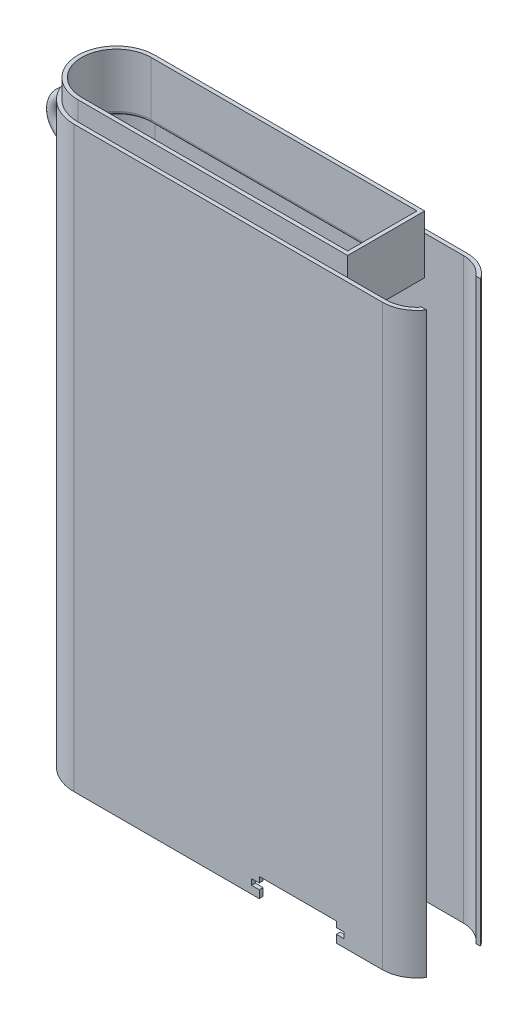
ISO-10303-21;
HEADER;
FILE_DESCRIPTION(('STEP AP214'),'2;1');
FILE_NAME('part.step','',(''),(''),'','','');
FILE_SCHEMA(('AUTOMOTIVE_DESIGN { 1 0 10303 214 1 1 1 1 }'));
ENDSEC;
DATA;
#1=APPLICATION_CONTEXT('core data for automotive mechanical design processes');
#2=APPLICATION_PROTOCOL_DEFINITION('international standard','automotive_design',2000,#1);
#3=PRODUCT_CONTEXT('',#1,'mechanical');
#4=PRODUCT('Part','Part','',(#3));
#5=PRODUCT_RELATED_PRODUCT_CATEGORY('part','',(#4));
#6=PRODUCT_DEFINITION_FORMATION('','',#4);
#7=PRODUCT_DEFINITION_CONTEXT('part definition',#1,'design');
#8=PRODUCT_DEFINITION('design','',#6,#7);
#9=PRODUCT_DEFINITION_SHAPE('','',#8);
#10=(LENGTH_UNIT() NAMED_UNIT(*) SI_UNIT(.MILLI.,.METRE.));
#11=(NAMED_UNIT(*) PLANE_ANGLE_UNIT() SI_UNIT($,.RADIAN.));
#12=(NAMED_UNIT(*) SI_UNIT($,.STERADIAN.) SOLID_ANGLE_UNIT());
#13=UNCERTAINTY_MEASURE_WITH_UNIT(LENGTH_MEASURE(1.E-05),#10,'distance_accuracy_value','');
#14=(GEOMETRIC_REPRESENTATION_CONTEXT(3) GLOBAL_UNCERTAINTY_ASSIGNED_CONTEXT((#13)) GLOBAL_UNIT_ASSIGNED_CONTEXT((#10,
#11,#12)) REPRESENTATION_CONTEXT('',''));
#15=CARTESIAN_POINT('',(0.,0.,0.));
#16=DIRECTION('',(0.,0.,1.));
#17=DIRECTION('',(1.,0.,0.));
#18=AXIS2_PLACEMENT_3D('',#15,#16,#17);
#19=CARTESIAN_POINT('',(-11.,145.,0.));
#20=DIRECTION('',(-1.,0.,0.));
#21=DIRECTION('',(0.,-1.,0.));
#22=AXIS2_PLACEMENT_3D('',#19,#20,#21);
#23=PLANE('',#22);
#24=CARTESIAN_POINT('',(-11.,145.,0.));
#25=DIRECTION('',(-1.,0.,0.));
#26=DIRECTION('',(0.,-1.,0.));
#27=AXIS2_PLACEMENT_3D('',#24,#25,#26);
#28=CIRCLE('',#27,1.5);
#29=CARTESIAN_POINT('',(-11.,146.5,0.));
#30=VERTEX_POINT('',#29);
#31=EDGE_CURVE('E61',#30,#30,#28,.T.);
#32=ORIENTED_EDGE('',*,*,#31,.F.);
#33=EDGE_LOOP('',(#32));
#34=FACE_BOUND('',#33,.T.);
#35=ADVANCED_FACE('F55',(#34),#23,.F.);
#36=CARTESIAN_POINT('',(-11.,135.,0.));
#37=DIRECTION('',(1.,0.,0.));
#38=DIRECTION('',(0.,1.,0.));
#39=AXIS2_PLACEMENT_3D('',#36,#37,#38);
#40=PLANE('',#39);
#41=CARTESIAN_POINT('',(-11.,135.,0.));
#42=DIRECTION('',(1.,0.,0.));
#43=DIRECTION('',(0.,1.,0.));
#44=AXIS2_PLACEMENT_3D('',#41,#42,#43);
#45=CIRCLE('',#44,1.5);
#46=CARTESIAN_POINT('',(-11.,133.5,0.));
#47=VERTEX_POINT('',#46);
#48=EDGE_CURVE('E12',#47,#47,#45,.T.);
#49=ORIENTED_EDGE('',*,*,#48,.T.);
#50=EDGE_LOOP('',(#49));
#51=FACE_BOUND('',#50,.T.);
#52=ADVANCED_FACE('F70',(#51),#40,.T.);
#53=CARTESIAN_POINT('',(-11.,140.,0.));
#54=DIRECTION('',(0.,0.,1.));
#55=DIRECTION('',(1.,0.,0.));
#56=AXIS2_PLACEMENT_3D('',#53,#54,#55);
#57=TOROIDAL_SURFACE('',#56,5.,1.5);
#58=CARTESIAN_POINT('',(-11.,140.,0.));
#59=DIRECTION('',(0.,0.,1.));
#60=DIRECTION('',(1.,0.,0.));
#61=AXIS2_PLACEMENT_3D('',#58,#59,#60);
#62=CIRCLE('',#61,6.5);
#63=EDGE_CURVE('',#30,#47,#62,.T.);
#64=ORIENTED_EDGE('',*,*,#31,.T.);
#65=ORIENTED_EDGE('',*,*,#48,.F.);
#66=ORIENTED_EDGE('',*,*,#63,.T.);
#67=ORIENTED_EDGE('',*,*,#63,.F.);
#68=EDGE_LOOP('',(#64,#66,#65,#67));
#69=FACE_BOUND('',#68,.T.);
#70=ADVANCED_FACE('F67',(#69),#57,.T.);
#71=CLOSED_SHELL('',(#35,#52,#70));
#72=MANIFOLD_SOLID_BREP('B2',#71);
#73=CARTESIAN_POINT('',(0.,155.,0.));
#74=DIRECTION('',(0.,1.,0.));
#75=DIRECTION('',(0.,0.,1.));
#76=AXIS2_PLACEMENT_3D('',#73,#74,#75);
#77=PLANE('',#76);
#78=CARTESIAN_POINT('',(0.,155.,0.));
#79=DIRECTION('',(0.,1.,0.));
#80=DIRECTION('',(0.,0.,1.));
#81=AXIS2_PLACEMENT_3D('',#78,#79,#80);
#82=CIRCLE('',#81,10.);
#83=CARTESIAN_POINT('',(0.,155.,-10.));
#84=VERTEX_POINT('',#83);
#85=CARTESIAN_POINT('',(0.,155.,10.));
#86=VERTEX_POINT('',#85);
#87=EDGE_CURVE('E209',#84,#86,#82,.T.);
#88=ORIENTED_EDGE('',*,*,#87,.T.);
#89=DIRECTION('',(1.,0.,0.));
#90=VECTOR('',#89,1.);
#91=CARTESIAN_POINT('',(0.,155.,10.));
#92=LINE('',#91,#90);
#93=CARTESIAN_POINT('',(70.,155.,10.));
#94=VERTEX_POINT('',#93);
#95=EDGE_CURVE('E212',#86,#94,#92,.T.);
#96=ORIENTED_EDGE('',*,*,#95,.T.);
#97=DIRECTION('',(0.,0.,-1.));
#98=VECTOR('',#97,1.);
#99=CARTESIAN_POINT('',(70.,155.,-10.));
#100=LINE('',#99,#98);
#101=CARTESIAN_POINT('',(70.,155.,-10.));
#102=VERTEX_POINT('',#101);
#103=EDGE_CURVE('E215',#94,#102,#100,.T.);
#104=ORIENTED_EDGE('',*,*,#103,.T.);
#105=DIRECTION('',(-1.,0.,0.));
#106=VECTOR('',#105,1.);
#107=CARTESIAN_POINT('',(0.,155.,-10.));
#108=LINE('',#107,#106);
#109=EDGE_CURVE('E217',#102,#84,#108,.T.);
#110=ORIENTED_EDGE('',*,*,#109,.T.);
#111=EDGE_LOOP('',(#88,#96,#104,#110));
#112=FACE_BOUND('',#111,.T.);
#113=DIRECTION('',(-1.,0.,0.));
#114=VECTOR('',#113,1.);
#115=CARTESIAN_POINT('',(0.,155.,-9.));
#116=LINE('',#115,#114);
#117=CARTESIAN_POINT('',(69.,155.,-9.));
#118=VERTEX_POINT('',#117);
#119=CARTESIAN_POINT('',(0.,155.,-9.));
#120=VERTEX_POINT('',#119);
#121=EDGE_CURVE('E189',#118,#120,#116,.T.);
#122=ORIENTED_EDGE('',*,*,#121,.F.);
#123=DIRECTION('',(0.,0.,-1.));
#124=VECTOR('',#123,1.);
#125=CARTESIAN_POINT('',(69.,155.,9.));
#126=LINE('',#125,#124);
#127=CARTESIAN_POINT('',(69.,155.,9.));
#128=VERTEX_POINT('',#127);
#129=EDGE_CURVE('E180',#128,#118,#126,.T.);
#130=ORIENTED_EDGE('',*,*,#129,.F.);
#131=DIRECTION('',(1.,0.,0.));
#132=VECTOR('',#131,1.);
#133=CARTESIAN_POINT('',(0.,155.,9.));
#134=LINE('',#133,#132);
#135=CARTESIAN_POINT('',(0.,155.,9.));
#136=VERTEX_POINT('',#135);
#137=EDGE_CURVE('E200',#136,#128,#134,.T.);
#138=ORIENTED_EDGE('',*,*,#137,.F.);
#139=CARTESIAN_POINT('',(0.,155.,0.));
#140=DIRECTION('',(0.,1.,0.));
#141=DIRECTION('',(0.,0.,1.));
#142=AXIS2_PLACEMENT_3D('',#139,#140,#141);
#143=CIRCLE('',#142,9.);
#144=EDGE_CURVE('E198',#120,#136,#143,.T.);
#145=ORIENTED_EDGE('',*,*,#144,.F.);
#146=EDGE_LOOP('',(#122,#130,#138,#145));
#147=FACE_BOUND('',#146,.T.);
#148=ADVANCED_FACE('F104',(#112,#147),#77,.T.);
#149=CARTESIAN_POINT('',(0.,140.,0.));
#150=DIRECTION('',(0.,1.,0.));
#151=DIRECTION('',(0.,0.,1.));
#152=AXIS2_PLACEMENT_3D('',#149,#150,#151);
#153=PLANE('',#152);
#154=DIRECTION('',(1.,0.,0.));
#155=VECTOR('',#154,1.);
#156=CARTESIAN_POINT('',(0.,140.,10.));
#157=LINE('',#156,#155);
#158=CARTESIAN_POINT('',(69.,140.,10.));
#159=VERTEX_POINT('',#158);
#160=CARTESIAN_POINT('',(70.,140.,10.));
#161=VERTEX_POINT('',#160);
#162=EDGE_CURVE('E222',#159,#161,#157,.T.);
#163=ORIENTED_EDGE('',*,*,#162,.F.);
#164=DIRECTION('',(0.,0.,-1.));
#165=VECTOR('',#164,1.);
#166=CARTESIAN_POINT('',(69.,140.,9.));
#167=LINE('',#166,#165);
#168=CARTESIAN_POINT('',(69.,140.,-10.));
#169=VERTEX_POINT('',#168);
#170=EDGE_CURVE('E190',#159,#169,#167,.T.);
#171=ORIENTED_EDGE('',*,*,#170,.T.);
#172=DIRECTION('',(-1.,0.,0.));
#173=VECTOR('',#172,1.);
#174=CARTESIAN_POINT('',(0.,140.,-10.));
#175=LINE('',#174,#173);
#176=CARTESIAN_POINT('',(70.,140.,-10.));
#177=VERTEX_POINT('',#176);
#178=EDGE_CURVE('E213',#177,#169,#175,.T.);
#179=ORIENTED_EDGE('',*,*,#178,.F.);
#180=DIRECTION('',(0.,0.,-1.));
#181=VECTOR('',#180,1.);
#182=CARTESIAN_POINT('',(70.,140.,-10.));
#183=LINE('',#182,#181);
#184=EDGE_CURVE('E226',#161,#177,#183,.T.);
#185=ORIENTED_EDGE('',*,*,#184,.F.);
#186=EDGE_LOOP('',(#163,#171,#179,#185));
#187=FACE_BOUND('',#186,.T.);
#188=ADVANCED_FACE('F268',(#187),#153,.F.);
#189=CARTESIAN_POINT('',(0.,155.,0.));
#190=DIRECTION('',(0.,-1.,0.));
#191=DIRECTION('',(0.,0.,-1.));
#192=AXIS2_PLACEMENT_3D('',#189,#190,#191);
#193=CYLINDRICAL_SURFACE('',#192,10.);
#194=CARTESIAN_POINT('',(0.,140.,0.));
#195=DIRECTION('',(0.,1.,0.));
#196=DIRECTION('',(0.,0.,1.));
#197=AXIS2_PLACEMENT_3D('',#194,#195,#196);
#198=CIRCLE('',#197,10.);
#199=CARTESIAN_POINT('',(0.,140.,-10.));
#200=VERTEX_POINT('',#199);
#201=CARTESIAN_POINT('',(0.,140.,10.));
#202=VERTEX_POINT('',#201);
#203=EDGE_CURVE('E193',#200,#202,#198,.T.);
#204=ORIENTED_EDGE('',*,*,#203,.T.);
#205=DIRECTION('',(0.,-1.,0.));
#206=VECTOR('',#205,1.);
#207=CARTESIAN_POINT('',(0.,155.,10.));
#208=LINE('',#207,#206);
#209=EDGE_CURVE('E239',#86,#202,#208,.T.);
#210=ORIENTED_EDGE('',*,*,#209,.F.);
#211=ORIENTED_EDGE('',*,*,#87,.F.);
#212=DIRECTION('',(0.,-1.,0.));
#213=VECTOR('',#212,1.);
#214=CARTESIAN_POINT('',(0.,155.,-10.));
#215=LINE('',#214,#213);
#216=EDGE_CURVE('E219',#84,#200,#215,.T.);
#217=ORIENTED_EDGE('',*,*,#216,.T.);
#218=EDGE_LOOP('',(#204,#210,#211,#217));
#219=FACE_BOUND('',#218,.T.);
#220=ADVANCED_FACE('F291',(#219),#193,.T.);
#221=CARTESIAN_POINT('',(0.,155.,10.));
#222=DIRECTION('',(0.,0.,-1.));
#223=DIRECTION('',(-1.,0.,0.));
#224=AXIS2_PLACEMENT_3D('',#221,#222,#223);
#225=PLANE('',#224);
#226=EDGE_CURVE('E223',#202,#159,#157,.T.);
#227=ORIENTED_EDGE('',*,*,#226,.T.);
#228=ORIENTED_EDGE('',*,*,#162,.T.);
#229=DIRECTION('',(0.,-1.,0.));
#230=VECTOR('',#229,1.);
#231=CARTESIAN_POINT('',(70.,155.,10.));
#232=LINE('',#231,#230);
#233=EDGE_CURVE('E236',#94,#161,#232,.T.);
#234=ORIENTED_EDGE('',*,*,#233,.F.);
#235=ORIENTED_EDGE('',*,*,#95,.F.);
#236=ORIENTED_EDGE('',*,*,#209,.T.);
#237=EDGE_LOOP('',(#227,#228,#234,#235,#236));
#238=FACE_BOUND('',#237,.T.);
#239=ADVANCED_FACE('F271',(#238),#225,.F.);
#240=CARTESIAN_POINT('',(70.,155.,-10.));
#241=DIRECTION('',(-1.,0.,0.));
#242=DIRECTION('',(0.,0.,1.));
#243=AXIS2_PLACEMENT_3D('',#240,#241,#242);
#244=PLANE('',#243);
#245=ORIENTED_EDGE('',*,*,#184,.T.);
#246=DIRECTION('',(0.,-1.,0.));
#247=VECTOR('',#246,1.);
#248=CARTESIAN_POINT('',(70.,155.,-10.));
#249=LINE('',#248,#247);
#250=EDGE_CURVE('E233',#102,#177,#249,.T.);
#251=ORIENTED_EDGE('',*,*,#250,.F.);
#252=ORIENTED_EDGE('',*,*,#103,.F.);
#253=ORIENTED_EDGE('',*,*,#233,.T.);
#254=EDGE_LOOP('',(#245,#251,#252,#253));
#255=FACE_BOUND('',#254,.T.);
#256=ADVANCED_FACE('F297',(#255),#244,.F.);
#257=CARTESIAN_POINT('',(0.,155.,-10.));
#258=DIRECTION('',(0.,0.,1.));
#259=DIRECTION('',(1.,0.,0.));
#260=AXIS2_PLACEMENT_3D('',#257,#258,#259);
#261=PLANE('',#260);
#262=ORIENTED_EDGE('',*,*,#178,.T.);
#263=EDGE_CURVE('E228',#169,#200,#175,.T.);
#264=ORIENTED_EDGE('',*,*,#263,.T.);
#265=ORIENTED_EDGE('',*,*,#216,.F.);
#266=ORIENTED_EDGE('',*,*,#109,.F.);
#267=ORIENTED_EDGE('',*,*,#250,.T.);
#268=EDGE_LOOP('',(#262,#264,#265,#266,#267));
#269=FACE_BOUND('',#268,.T.);
#270=ADVANCED_FACE('F261',(#269),#261,.F.);
#271=CARTESIAN_POINT('',(69.,155.,9.));
#272=DIRECTION('',(-1.,0.,0.));
#273=DIRECTION('',(0.,0.,1.));
#274=AXIS2_PLACEMENT_3D('',#271,#272,#273);
#275=PLANE('',#274);
#276=ORIENTED_EDGE('',*,*,#170,.F.);
#277=CARTESIAN_POINT('',(69.,141.,10.));
#278=DIRECTION('',(-1.,0.,0.));
#279=DIRECTION('',(0.,0.,1.));
#280=AXIS2_PLACEMENT_3D('',#277,#278,#279);
#281=CIRCLE('',#280,1.);
#282=CARTESIAN_POINT('',(69.,141.,9.));
#283=VERTEX_POINT('',#282);
#284=EDGE_CURVE('E113',#159,#283,#281,.F.);
#285=ORIENTED_EDGE('',*,*,#284,.T.);
#286=DIRECTION('',(0.,-1.,0.));
#287=VECTOR('',#286,1.);
#288=CARTESIAN_POINT('',(69.,155.,9.));
#289=LINE('',#288,#287);
#290=EDGE_CURVE('E185',#128,#283,#289,.T.);
#291=ORIENTED_EDGE('',*,*,#290,.F.);
#292=ORIENTED_EDGE('',*,*,#129,.T.);
#293=DIRECTION('',(0.,-1.,0.));
#294=VECTOR('',#293,1.);
#295=CARTESIAN_POINT('',(69.,155.,-9.));
#296=LINE('',#295,#294);
#297=CARTESIAN_POINT('',(69.,141.,-9.));
#298=VERTEX_POINT('',#297);
#299=EDGE_CURVE('E182',#118,#298,#296,.T.);
#300=ORIENTED_EDGE('',*,*,#299,.T.);
#301=CARTESIAN_POINT('',(69.,141.,-10.));
#302=DIRECTION('',(-1.,0.,0.));
#303=DIRECTION('',(0.,0.,1.));
#304=AXIS2_PLACEMENT_3D('',#301,#302,#303);
#305=CIRCLE('',#304,1.);
#306=EDGE_CURVE('E53',#298,#169,#305,.F.);
#307=ORIENTED_EDGE('',*,*,#306,.T.);
#308=EDGE_LOOP('',(#276,#285,#291,#292,#300,#307));
#309=FACE_BOUND('',#308,.T.);
#310=ADVANCED_FACE('F181',(#309),#275,.T.);
#311=CARTESIAN_POINT('',(0.,155.,-9.));
#312=DIRECTION('',(0.,0.,1.));
#313=DIRECTION('',(1.,0.,0.));
#314=AXIS2_PLACEMENT_3D('',#311,#312,#313);
#315=PLANE('',#314);
#316=DIRECTION('',(0.,-1.,0.));
#317=VECTOR('',#316,1.);
#318=CARTESIAN_POINT('',(0.,155.,-9.));
#319=LINE('',#318,#317);
#320=CARTESIAN_POINT('',(0.,141.,-9.));
#321=VERTEX_POINT('',#320);
#322=EDGE_CURVE('E194',#120,#321,#319,.T.);
#323=ORIENTED_EDGE('',*,*,#322,.T.);
#324=DIRECTION('',(-1.,0.,0.));
#325=VECTOR('',#324,1.);
#326=CARTESIAN_POINT('',(69.,141.,-9.));
#327=LINE('',#326,#325);
#328=EDGE_CURVE('E121',#321,#298,#327,.F.);
#329=ORIENTED_EDGE('',*,*,#328,.T.);
#330=ORIENTED_EDGE('',*,*,#299,.F.);
#331=ORIENTED_EDGE('',*,*,#121,.T.);
#332=EDGE_LOOP('',(#323,#329,#330,#331));
#333=FACE_BOUND('',#332,.T.);
#334=ADVANCED_FACE('F192',(#333),#315,.T.);
#335=CARTESIAN_POINT('',(0.,155.,0.));
#336=DIRECTION('',(0.,-1.,0.));
#337=DIRECTION('',(0.,0.,-1.));
#338=AXIS2_PLACEMENT_3D('',#335,#336,#337);
#339=CYLINDRICAL_SURFACE('',#338,9.);
#340=DIRECTION('',(0.,-1.,0.));
#341=VECTOR('',#340,1.);
#342=CARTESIAN_POINT('',(0.,155.,9.));
#343=LINE('',#342,#341);
#344=CARTESIAN_POINT('',(0.,141.,9.));
#345=VERTEX_POINT('',#344);
#346=EDGE_CURVE('E206',#136,#345,#343,.T.);
#347=ORIENTED_EDGE('',*,*,#346,.T.);
#348=CARTESIAN_POINT('',(0.,141.,0.));
#349=DIRECTION('',(0.,1.,0.));
#350=DIRECTION('',(0.,0.,1.));
#351=AXIS2_PLACEMENT_3D('',#348,#349,#350);
#352=CIRCLE('',#351,9.);
#353=EDGE_CURVE('E129',#345,#321,#352,.F.);
#354=ORIENTED_EDGE('',*,*,#353,.T.);
#355=ORIENTED_EDGE('',*,*,#322,.F.);
#356=ORIENTED_EDGE('',*,*,#144,.T.);
#357=EDGE_LOOP('',(#347,#354,#355,#356));
#358=FACE_BOUND('',#357,.T.);
#359=ADVANCED_FACE('F276',(#358),#339,.F.);
#360=CARTESIAN_POINT('',(0.,155.,9.));
#361=DIRECTION('',(0.,0.,-1.));
#362=DIRECTION('',(-1.,0.,0.));
#363=AXIS2_PLACEMENT_3D('',#360,#361,#362);
#364=PLANE('',#363);
#365=ORIENTED_EDGE('',*,*,#290,.T.);
#366=DIRECTION('',(1.,0.,0.));
#367=VECTOR('',#366,1.);
#368=CARTESIAN_POINT('',(0.,141.,9.));
#369=LINE('',#368,#367);
#370=EDGE_CURVE('E241',#283,#345,#369,.F.);
#371=ORIENTED_EDGE('',*,*,#370,.T.);
#372=ORIENTED_EDGE('',*,*,#346,.F.);
#373=ORIENTED_EDGE('',*,*,#137,.T.);
#374=EDGE_LOOP('',(#365,#371,#372,#373));
#375=FACE_BOUND('',#374,.T.);
#376=ADVANCED_FACE('F275',(#375),#364,.T.);
#377=CARTESIAN_POINT('',(0.,141.,-10.));
#378=DIRECTION('',(1.,0.,0.));
#379=DIRECTION('',(0.,0.,-1.));
#380=AXIS2_PLACEMENT_3D('',#377,#378,#379);
#381=CYLINDRICAL_SURFACE('',#380,1.);
#382=ORIENTED_EDGE('',*,*,#306,.F.);
#383=ORIENTED_EDGE('',*,*,#328,.F.);
#384=CARTESIAN_POINT('',(0.,141.,-10.));
#385=DIRECTION('',(-1.,0.,0.));
#386=DIRECTION('',(0.,0.,1.));
#387=AXIS2_PLACEMENT_3D('',#384,#385,#386);
#388=CIRCLE('',#387,1.);
#389=EDGE_CURVE('E108',#200,#321,#388,.T.);
#390=ORIENTED_EDGE('',*,*,#389,.F.);
#391=ORIENTED_EDGE('',*,*,#263,.F.);
#392=EDGE_LOOP('',(#382,#383,#390,#391));
#393=FACE_BOUND('',#392,.T.);
#394=ADVANCED_FACE('F106',(#393),#381,.T.);
#395=CARTESIAN_POINT('',(0.,141.,0.));
#396=DIRECTION('',(0.,1.,0.));
#397=DIRECTION('',(0.,0.,1.));
#398=AXIS2_PLACEMENT_3D('',#395,#396,#397);
#399=TOROIDAL_SURFACE('',#398,10.,1.);
#400=ORIENTED_EDGE('',*,*,#389,.T.);
#401=ORIENTED_EDGE('',*,*,#353,.F.);
#402=CARTESIAN_POINT('',(0.,141.,10.));
#403=DIRECTION('',(1.,0.,0.));
#404=DIRECTION('',(0.,0.,-1.));
#405=AXIS2_PLACEMENT_3D('',#402,#403,#404);
#406=CIRCLE('',#405,1.);
#407=EDGE_CURVE('E245',#202,#345,#406,.T.);
#408=ORIENTED_EDGE('',*,*,#407,.F.);
#409=ORIENTED_EDGE('',*,*,#203,.F.);
#410=EDGE_LOOP('',(#400,#401,#408,#409));
#411=FACE_BOUND('',#410,.T.);
#412=ADVANCED_FACE('F255',(#411),#399,.T.);
#413=CARTESIAN_POINT('',(0.,141.,10.));
#414=DIRECTION('',(-1.,0.,0.));
#415=DIRECTION('',(0.,0.,1.));
#416=AXIS2_PLACEMENT_3D('',#413,#414,#415);
#417=CYLINDRICAL_SURFACE('',#416,1.);
#418=ORIENTED_EDGE('',*,*,#407,.T.);
#419=ORIENTED_EDGE('',*,*,#370,.F.);
#420=ORIENTED_EDGE('',*,*,#284,.F.);
#421=ORIENTED_EDGE('',*,*,#226,.F.);
#422=EDGE_LOOP('',(#418,#419,#420,#421));
#423=FACE_BOUND('',#422,.T.);
#424=ADVANCED_FACE('F273',(#423),#417,.T.);
#425=CLOSED_SHELL('',(#148,#188,#220,#239,#256,#270,#310,#334,#359,#376,#394,#412,#424));
#426=MANIFOLD_SOLID_BREP('B7',#425);
#427=CARTESIAN_POINT('',(0.,150.,11.));
#428=DIRECTION('',(0.,0.,-1.));
#429=DIRECTION('',(-1.,0.,0.));
#430=AXIS2_PLACEMENT_3D('',#427,#428,#429);
#431=PLANE('',#430);
#432=DIRECTION('',(0.,-1.,0.));
#433=VECTOR('',#432,1.);
#434=CARTESIAN_POINT('',(48.06573179,150.,11.));
#435=LINE('',#434,#433);
#436=CARTESIAN_POINT('',(48.06573179,2.,11.));
#437=VERTEX_POINT('',#436);
#438=CARTESIAN_POINT('',(48.06573179,0.,11.));
#439=VERTEX_POINT('',#438);
#440=EDGE_CURVE('E616',#437,#439,#435,.T.);
#441=ORIENTED_EDGE('',*,*,#440,.F.);
#442=DIRECTION('',(1.,0.,0.));
#443=VECTOR('',#442,1.);
#444=CARTESIAN_POINT('',(0.,2.,11.));
#445=LINE('',#444,#443);
#446=CARTESIAN_POINT('',(46.06573179,2.,11.));
#447=VERTEX_POINT('',#446);
#448=EDGE_CURVE('E643',#447,#437,#445,.T.);
#449=ORIENTED_EDGE('',*,*,#448,.F.);
#450=DIRECTION('',(0.,-1.,0.));
#451=VECTOR('',#450,1.);
#452=CARTESIAN_POINT('',(46.06573179,150.,11.));
#453=LINE('',#452,#451);
#454=CARTESIAN_POINT('',(46.06573179,3.5,11.));
#455=VERTEX_POINT('',#454);
#456=EDGE_CURVE('E649',#455,#447,#453,.T.);
#457=ORIENTED_EDGE('',*,*,#456,.F.);
#458=DIRECTION('',(-1.,0.,0.));
#459=VECTOR('',#458,1.);
#460=CARTESIAN_POINT('',(0.,3.5,11.));
#461=LINE('',#460,#459);
#462=CARTESIAN_POINT('',(48.06573179,3.5,11.));
#463=VERTEX_POINT('',#462);
#464=EDGE_CURVE('E655',#463,#455,#461,.T.);
#465=ORIENTED_EDGE('',*,*,#464,.F.);
#466=DIRECTION('',(0.,-1.,0.));
#467=VECTOR('',#466,1.);
#468=CARTESIAN_POINT('',(48.06573179,150.,11.));
#469=LINE('',#468,#467);
#470=CARTESIAN_POINT('',(48.06573179,5.,11.));
#471=VERTEX_POINT('',#470);
#472=EDGE_CURVE('E661',#471,#463,#469,.T.);
#473=ORIENTED_EDGE('',*,*,#472,.F.);
#474=DIRECTION('',(-1.,0.,0.));
#475=VECTOR('',#474,1.);
#476=CARTESIAN_POINT('',(0.,5.,11.));
#477=LINE('',#476,#475);
#478=CARTESIAN_POINT('',(68.06573179,5.,11.));
#479=VERTEX_POINT('',#478);
#480=EDGE_CURVE('E667',#479,#471,#477,.T.);
#481=ORIENTED_EDGE('',*,*,#480,.F.);
#482=DIRECTION('',(0.,1.,0.));
#483=VECTOR('',#482,1.);
#484=CARTESIAN_POINT('',(68.06573179,150.,11.));
#485=LINE('',#484,#483);
#486=CARTESIAN_POINT('',(68.06573179,3.5,11.));
#487=VERTEX_POINT('',#486);
#488=EDGE_CURVE('E526',#487,#479,#485,.T.);
#489=ORIENTED_EDGE('',*,*,#488,.F.);
#490=DIRECTION('',(-1.,0.,0.));
#491=VECTOR('',#490,1.);
#492=CARTESIAN_POINT('',(0.,3.5,11.));
#493=LINE('',#492,#491);
#494=CARTESIAN_POINT('',(70.06573179,3.5,11.));
#495=VERTEX_POINT('',#494);
#496=EDGE_CURVE('E627',#495,#487,#493,.T.);
#497=ORIENTED_EDGE('',*,*,#496,.F.);
#498=DIRECTION('',(0.,1.,0.));
#499=VECTOR('',#498,1.);
#500=CARTESIAN_POINT('',(70.0657317899973,150.000000000001,11.));
#501=LINE('',#500,#499);
#502=CARTESIAN_POINT('',(70.06573179,2.,11.));
#503=VERTEX_POINT('',#502);
#504=EDGE_CURVE('E633',#503,#495,#501,.T.);
#505=ORIENTED_EDGE('',*,*,#504,.F.);
#506=DIRECTION('',(1.,0.,0.));
#507=VECTOR('',#506,1.);
#508=CARTESIAN_POINT('',(0.,2.,11.));
#509=LINE('',#508,#507);
#510=CARTESIAN_POINT('',(68.06573179,2.,11.));
#511=VERTEX_POINT('',#510);
#512=EDGE_CURVE('E610',#511,#503,#509,.T.);
#513=ORIENTED_EDGE('',*,*,#512,.F.);
#514=DIRECTION('',(0.,1.,0.));
#515=VECTOR('',#514,1.);
#516=CARTESIAN_POINT('',(68.06573179,150.,11.));
#517=LINE('',#516,#515);
#518=CARTESIAN_POINT('',(68.06573179,0.,11.));
#519=VERTEX_POINT('',#518);
#520=EDGE_CURVE('E606',#519,#511,#517,.T.);
#521=ORIENTED_EDGE('',*,*,#520,.F.);
#522=DIRECTION('',(1.,0.,0.));
#523=VECTOR('',#522,1.);
#524=CARTESIAN_POINT('',(0.,0.,11.));
#525=LINE('',#524,#523);
#526=CARTESIAN_POINT('',(80.,0.,11.));
#527=VERTEX_POINT('',#526);
#528=EDGE_CURVE('E534',#519,#527,#525,.T.);
#529=ORIENTED_EDGE('',*,*,#528,.T.);
#530=DIRECTION('',(0.,-1.,0.));
#531=VECTOR('',#530,1.);
#532=CARTESIAN_POINT('',(80.,150.,11.));
#533=LINE('',#532,#531);
#534=CARTESIAN_POINT('',(80.,150.,11.));
#535=VERTEX_POINT('',#534);
#536=EDGE_CURVE('E560',#535,#527,#533,.T.);
#537=ORIENTED_EDGE('',*,*,#536,.F.);
#538=DIRECTION('',(1.,0.,0.));
#539=VECTOR('',#538,1.);
#540=CARTESIAN_POINT('',(0.,150.,11.));
#541=LINE('',#540,#539);
#542=CARTESIAN_POINT('',(0.,150.,11.));
#543=VERTEX_POINT('',#542);
#544=EDGE_CURVE('E604',#543,#535,#541,.T.);
#545=ORIENTED_EDGE('',*,*,#544,.F.);
#546=DIRECTION('',(0.,-1.,0.));
#547=VECTOR('',#546,1.);
#548=CARTESIAN_POINT('',(0.,150.,11.));
#549=LINE('',#548,#547);
#550=CARTESIAN_POINT('',(0.,0.,11.));
#551=VERTEX_POINT('',#550);
#552=EDGE_CURVE('E563',#543,#551,#549,.T.);
#553=ORIENTED_EDGE('',*,*,#552,.T.);
#554=EDGE_CURVE('E535',#551,#439,#525,.T.);
#555=ORIENTED_EDGE('',*,*,#554,.T.);
#556=EDGE_LOOP('',(#441,#449,#457,#465,#473,#481,#489,#497,#505,#513,#521,#529,#537,#545,#553,#555));
#557=FACE_BOUND('',#556,.T.);
#558=ADVANCED_FACE('F388',(#557),#431,.F.);
#559=CARTESIAN_POINT('',(0.,150.,10.));
#560=DIRECTION('',(0.,0.,1.));
#561=DIRECTION('',(1.,0.,0.));
#562=AXIS2_PLACEMENT_3D('',#559,#560,#561);
#563=PLANE('',#562);
#564=DIRECTION('',(0.,1.,0.));
#565=VECTOR('',#564,1.);
#566=CARTESIAN_POINT('',(48.06573179,150.,10.));
#567=LINE('',#566,#565);
#568=CARTESIAN_POINT('',(48.06573179,0.,10.));
#569=VERTEX_POINT('',#568);
#570=CARTESIAN_POINT('',(48.06573179,2.,10.));
#571=VERTEX_POINT('',#570);
#572=EDGE_CURVE('E613',#569,#571,#567,.T.);
#573=ORIENTED_EDGE('',*,*,#572,.F.);
#574=DIRECTION('',(-1.,0.,0.));
#575=VECTOR('',#574,1.);
#576=CARTESIAN_POINT('',(0.,0.,10.));
#577=LINE('',#576,#575);
#578=CARTESIAN_POINT('',(0.,0.,10.));
#579=VERTEX_POINT('',#578);
#580=EDGE_CURVE('E510',#569,#579,#577,.T.);
#581=ORIENTED_EDGE('',*,*,#580,.T.);
#582=DIRECTION('',(0.,-1.,0.));
#583=VECTOR('',#582,1.);
#584=CARTESIAN_POINT('',(0.,150.,10.));
#585=LINE('',#584,#583);
#586=CARTESIAN_POINT('',(0.,150.,10.));
#587=VERTEX_POINT('',#586);
#588=EDGE_CURVE('E506',#587,#579,#585,.T.);
#589=ORIENTED_EDGE('',*,*,#588,.F.);
#590=DIRECTION('',(-1.,0.,0.));
#591=VECTOR('',#590,1.);
#592=CARTESIAN_POINT('',(0.,150.,10.));
#593=LINE('',#592,#591);
#594=CARTESIAN_POINT('',(80.,150.,10.));
#595=VERTEX_POINT('',#594);
#596=EDGE_CURVE('E493',#595,#587,#593,.T.);
#597=ORIENTED_EDGE('',*,*,#596,.F.);
#598=DIRECTION('',(0.,-1.,0.));
#599=VECTOR('',#598,1.);
#600=CARTESIAN_POINT('',(80.,150.,10.));
#601=LINE('',#600,#599);
#602=CARTESIAN_POINT('',(80.,0.,10.));
#603=VERTEX_POINT('',#602);
#604=EDGE_CURVE('E513',#595,#603,#601,.T.);
#605=ORIENTED_EDGE('',*,*,#604,.T.);
#606=CARTESIAN_POINT('',(68.06573179,0.,10.));
#607=VERTEX_POINT('',#606);
#608=EDGE_CURVE('E544',#603,#607,#577,.T.);
#609=ORIENTED_EDGE('',*,*,#608,.T.);
#610=DIRECTION('',(0.,-1.,0.));
#611=VECTOR('',#610,1.);
#612=CARTESIAN_POINT('',(68.06573179,150.,10.));
#613=LINE('',#612,#611);
#614=CARTESIAN_POINT('',(68.06573179,2.,10.));
#615=VERTEX_POINT('',#614);
#616=EDGE_CURVE('E403',#615,#607,#613,.T.);
#617=ORIENTED_EDGE('',*,*,#616,.F.);
#618=DIRECTION('',(-1.,0.,0.));
#619=VECTOR('',#618,1.);
#620=CARTESIAN_POINT('',(0.,2.,10.));
#621=LINE('',#620,#619);
#622=CARTESIAN_POINT('',(70.06573179,2.,10.));
#623=VERTEX_POINT('',#622);
#624=EDGE_CURVE('E636',#623,#615,#621,.T.);
#625=ORIENTED_EDGE('',*,*,#624,.F.);
#626=DIRECTION('',(0.,-1.,0.));
#627=VECTOR('',#626,1.);
#628=CARTESIAN_POINT('',(70.0657317899973,150.000000000001,10.));
#629=LINE('',#628,#627);
#630=CARTESIAN_POINT('',(70.06573179,3.5,10.));
#631=VERTEX_POINT('',#630);
#632=EDGE_CURVE('E630',#631,#623,#629,.T.);
#633=ORIENTED_EDGE('',*,*,#632,.F.);
#634=DIRECTION('',(1.,0.,0.));
#635=VECTOR('',#634,1.);
#636=CARTESIAN_POINT('',(0.,3.5,10.));
#637=LINE('',#636,#635);
#638=CARTESIAN_POINT('',(68.06573179,3.5,10.));
#639=VERTEX_POINT('',#638);
#640=EDGE_CURVE('E624',#639,#631,#637,.T.);
#641=ORIENTED_EDGE('',*,*,#640,.F.);
#642=DIRECTION('',(0.,-1.,0.));
#643=VECTOR('',#642,1.);
#644=CARTESIAN_POINT('',(68.06573179,150.,10.));
#645=LINE('',#644,#643);
#646=CARTESIAN_POINT('',(68.06573179,5.,10.));
#647=VERTEX_POINT('',#646);
#648=EDGE_CURVE('E670',#647,#639,#645,.T.);
#649=ORIENTED_EDGE('',*,*,#648,.F.);
#650=DIRECTION('',(1.,0.,0.));
#651=VECTOR('',#650,1.);
#652=CARTESIAN_POINT('',(0.,5.,10.));
#653=LINE('',#652,#651);
#654=CARTESIAN_POINT('',(48.06573179,5.,10.));
#655=VERTEX_POINT('',#654);
#656=EDGE_CURVE('E664',#655,#647,#653,.T.);
#657=ORIENTED_EDGE('',*,*,#656,.F.);
#658=DIRECTION('',(0.,1.,0.));
#659=VECTOR('',#658,1.);
#660=CARTESIAN_POINT('',(48.06573179,150.,10.));
#661=LINE('',#660,#659);
#662=CARTESIAN_POINT('',(48.06573179,3.5,10.));
#663=VERTEX_POINT('',#662);
#664=EDGE_CURVE('E658',#663,#655,#661,.T.);
#665=ORIENTED_EDGE('',*,*,#664,.F.);
#666=DIRECTION('',(1.,0.,0.));
#667=VECTOR('',#666,1.);
#668=CARTESIAN_POINT('',(0.,3.5,10.));
#669=LINE('',#668,#667);
#670=CARTESIAN_POINT('',(46.06573179,3.5,10.));
#671=VERTEX_POINT('',#670);
#672=EDGE_CURVE('E652',#671,#663,#669,.T.);
#673=ORIENTED_EDGE('',*,*,#672,.F.);
#674=DIRECTION('',(0.,1.,0.));
#675=VECTOR('',#674,1.);
#676=CARTESIAN_POINT('',(46.06573179,150.,10.));
#677=LINE('',#676,#675);
#678=CARTESIAN_POINT('',(46.06573179,2.,10.));
#679=VERTEX_POINT('',#678);
#680=EDGE_CURVE('E646',#679,#671,#677,.T.);
#681=ORIENTED_EDGE('',*,*,#680,.F.);
#682=DIRECTION('',(-1.,0.,0.));
#683=VECTOR('',#682,1.);
#684=CARTESIAN_POINT('',(0.,2.,10.));
#685=LINE('',#684,#683);
#686=EDGE_CURVE('E640',#571,#679,#685,.T.);
#687=ORIENTED_EDGE('',*,*,#686,.F.);
#688=EDGE_LOOP('',(#573,#581,#589,#597,#605,#609,#617,#625,#633,#641,#649,#657,#665,#673,#681,#687));
#689=FACE_BOUND('',#688,.T.);
#690=ADVANCED_FACE('F508',(#689),#563,.F.);
#691=CARTESIAN_POINT('',(80.,0.,-2.));
#692=DIRECTION('',(0.,-1.,0.));
#693=DIRECTION('',(0.,0.,-1.));
#694=AXIS2_PLACEMENT_3D('',#691,#692,#693);
#695=PLANE('',#694);
#696=ORIENTED_EDGE('',*,*,#580,.F.);
#697=DIRECTION('',(0.,0.,1.));
#698=VECTOR('',#697,1.);
#699=CARTESIAN_POINT('',(48.06573179,0.,-2.));
#700=LINE('',#699,#698);
#701=EDGE_CURVE('E102',#569,#439,#700,.T.);
#702=ORIENTED_EDGE('',*,*,#701,.T.);
#703=ORIENTED_EDGE('',*,*,#554,.F.);
#704=CARTESIAN_POINT('',(0.,0.,0.));
#705=DIRECTION('',(0.,1.,0.));
#706=DIRECTION('',(0.,0.,1.));
#707=AXIS2_PLACEMENT_3D('',#704,#705,#706);
#708=CIRCLE('',#707,11.);
#709=CARTESIAN_POINT('',(0.,0.,-11.));
#710=VERTEX_POINT('',#709);
#711=EDGE_CURVE('E532',#710,#551,#708,.T.);
#712=ORIENTED_EDGE('',*,*,#711,.F.);
#713=DIRECTION('',(-1.,0.,0.));
#714=VECTOR('',#713,1.);
#715=CARTESIAN_POINT('',(0.,0.,-11.));
#716=LINE('',#715,#714);
#717=CARTESIAN_POINT('',(80.,0.,-11.));
#718=VERTEX_POINT('',#717);
#719=EDGE_CURVE('E530',#718,#710,#716,.T.);
#720=ORIENTED_EDGE('',*,*,#719,.F.);
#721=CARTESIAN_POINT('',(80.,0.,-2.));
#722=DIRECTION('',(0.,1.,0.));
#723=DIRECTION('',(0.,0.,-1.));
#724=AXIS2_PLACEMENT_3D('',#721,#722,#723);
#725=CIRCLE('',#724,9.);
#726=CARTESIAN_POINT('',(87.4833147735479,0.,-7.));
#727=VERTEX_POINT('',#726);
#728=EDGE_CURVE('E528',#727,#718,#725,.T.);
#729=ORIENTED_EDGE('',*,*,#728,.F.);
#730=DIRECTION('',(1.,0.,0.));
#731=VECTOR('',#730,1.);
#732=CARTESIAN_POINT('',(86.2449979983984,0.,-7.));
#733=LINE('',#732,#731);
#734=CARTESIAN_POINT('',(86.2449979983984,0.,-7.));
#735=VERTEX_POINT('',#734);
#736=EDGE_CURVE('E525',#735,#727,#733,.T.);
#737=ORIENTED_EDGE('',*,*,#736,.F.);
#738=CARTESIAN_POINT('',(80.,0.,-2.));
#739=DIRECTION('',(0.,-1.,0.));
#740=DIRECTION('',(0.,0.,-1.));
#741=AXIS2_PLACEMENT_3D('',#738,#739,#740);
#742=CIRCLE('',#741,8.);
#743=CARTESIAN_POINT('',(80.,0.,-10.));
#744=VERTEX_POINT('',#743);
#745=EDGE_CURVE('E522',#744,#735,#742,.T.);
#746=ORIENTED_EDGE('',*,*,#745,.F.);
#747=DIRECTION('',(1.,0.,0.));
#748=VECTOR('',#747,1.);
#749=CARTESIAN_POINT('',(0.,0.,-10.));
#750=LINE('',#749,#748);
#751=CARTESIAN_POINT('',(0.,0.,-10.));
#752=VERTEX_POINT('',#751);
#753=EDGE_CURVE('E457',#752,#744,#750,.T.);
#754=ORIENTED_EDGE('',*,*,#753,.F.);
#755=CARTESIAN_POINT('',(0.,0.,0.));
#756=DIRECTION('',(0.,-1.,0.));
#757=DIRECTION('',(0.,0.,1.));
#758=AXIS2_PLACEMENT_3D('',#755,#756,#757);
#759=CIRCLE('',#758,10.);
#760=EDGE_CURVE('E547',#579,#752,#759,.T.);
#761=ORIENTED_EDGE('',*,*,#760,.F.);
#762=EDGE_LOOP('',(#696,#702,#703,#712,#720,#729,#737,#746,#754,#761));
#763=FACE_BOUND('',#762,.T.);
#764=ADVANCED_FACE('F695',(#763),#695,.T.);
#765=ORIENTED_EDGE('',*,*,#528,.F.);
#766=DIRECTION('',(0.,0.,-1.));
#767=VECTOR('',#766,1.);
#768=CARTESIAN_POINT('',(68.06573179,0.,-2.));
#769=LINE('',#768,#767);
#770=EDGE_CURVE('E396',#519,#607,#769,.T.);
#771=ORIENTED_EDGE('',*,*,#770,.T.);
#772=ORIENTED_EDGE('',*,*,#608,.F.);
#773=CARTESIAN_POINT('',(80.,0.,2.));
#774=DIRECTION('',(0.,-1.,0.));
#775=DIRECTION('',(0.,0.,1.));
#776=AXIS2_PLACEMENT_3D('',#773,#774,#775);
#777=CIRCLE('',#776,8.);
#778=CARTESIAN_POINT('',(86.2449979983984,0.,7.));
#779=VERTEX_POINT('',#778);
#780=EDGE_CURVE('E542',#779,#603,#777,.T.);
#781=ORIENTED_EDGE('',*,*,#780,.F.);
#782=DIRECTION('',(-1.,0.,0.));
#783=VECTOR('',#782,1.);
#784=CARTESIAN_POINT('',(86.2449979983984,0.,7.));
#785=LINE('',#784,#783);
#786=CARTESIAN_POINT('',(87.4833147735479,0.,7.));
#787=VERTEX_POINT('',#786);
#788=EDGE_CURVE('E540',#787,#779,#785,.T.);
#789=ORIENTED_EDGE('',*,*,#788,.F.);
#790=CARTESIAN_POINT('',(80.,0.,2.));
#791=DIRECTION('',(0.,1.,0.));
#792=DIRECTION('',(0.,0.,1.));
#793=AXIS2_PLACEMENT_3D('',#790,#791,#792);
#794=CIRCLE('',#793,9.);
#795=EDGE_CURVE('E538',#527,#787,#794,.T.);
#796=ORIENTED_EDGE('',*,*,#795,.F.);
#797=EDGE_LOOP('',(#765,#771,#772,#781,#789,#796));
#798=FACE_BOUND('',#797,.T.);
#799=ADVANCED_FACE('F579',(#798),#695,.T.);
#800=CARTESIAN_POINT('',(80.,150.,-2.));
#801=DIRECTION('',(0.,-1.,0.));
#802=DIRECTION('',(0.,0.,-1.));
#803=AXIS2_PLACEMENT_3D('',#800,#801,#802);
#804=CYLINDRICAL_SURFACE('',#803,8.);
#805=ORIENTED_EDGE('',*,*,#745,.T.);
#806=DIRECTION('',(0.,-1.,0.));
#807=VECTOR('',#806,1.);
#808=CARTESIAN_POINT('',(86.2449979983984,150.,-7.));
#809=LINE('',#808,#807);
#810=CARTESIAN_POINT('',(86.2449979983984,150.,-7.));
#811=VERTEX_POINT('',#810);
#812=EDGE_CURVE('E575',#811,#735,#809,.T.);
#813=ORIENTED_EDGE('',*,*,#812,.F.);
#814=CARTESIAN_POINT('',(80.,150.,-2.));
#815=DIRECTION('',(0.,-1.,0.));
#816=DIRECTION('',(0.,0.,-1.));
#817=AXIS2_PLACEMENT_3D('',#814,#815,#816);
#818=CIRCLE('',#817,8.);
#819=CARTESIAN_POINT('',(80.,150.,-10.));
#820=VERTEX_POINT('',#819);
#821=EDGE_CURVE('E550',#820,#811,#818,.T.);
#822=ORIENTED_EDGE('',*,*,#821,.F.);
#823=DIRECTION('',(0.,-1.,0.));
#824=VECTOR('',#823,1.);
#825=CARTESIAN_POINT('',(80.,150.,-10.));
#826=LINE('',#825,#824);
#827=EDGE_CURVE('E518',#820,#744,#826,.T.);
#828=ORIENTED_EDGE('',*,*,#827,.T.);
#829=EDGE_LOOP('',(#805,#813,#822,#828));
#830=FACE_BOUND('',#829,.T.);
#831=ADVANCED_FACE('F390',(#830),#804,.F.);
#832=CARTESIAN_POINT('',(86.2449979983984,150.,-7.));
#833=DIRECTION('',(0.,0.,-1.));
#834=DIRECTION('',(-1.,0.,0.));
#835=AXIS2_PLACEMENT_3D('',#832,#833,#834);
#836=PLANE('',#835);
#837=ORIENTED_EDGE('',*,*,#736,.T.);
#838=DIRECTION('',(0.,-1.,0.));
#839=VECTOR('',#838,1.);
#840=CARTESIAN_POINT('',(87.4833147735479,150.,-7.));
#841=LINE('',#840,#839);
#842=CARTESIAN_POINT('',(87.4833147735479,150.,-7.));
#843=VERTEX_POINT('',#842);
#844=EDGE_CURVE('E572',#843,#727,#841,.T.);
#845=ORIENTED_EDGE('',*,*,#844,.F.);
#846=DIRECTION('',(1.,0.,0.));
#847=VECTOR('',#846,1.);
#848=CARTESIAN_POINT('',(86.2449979983984,150.,-7.));
#849=LINE('',#848,#847);
#850=EDGE_CURVE('E466',#811,#843,#849,.T.);
#851=ORIENTED_EDGE('',*,*,#850,.F.);
#852=ORIENTED_EDGE('',*,*,#812,.T.);
#853=EDGE_LOOP('',(#837,#845,#851,#852));
#854=FACE_BOUND('',#853,.T.);
#855=ADVANCED_FACE('F833',(#854),#836,.F.);
#856=CARTESIAN_POINT('',(80.,150.,-2.));
#857=DIRECTION('',(0.,-1.,0.));
#858=DIRECTION('',(0.,0.,-1.));
#859=AXIS2_PLACEMENT_3D('',#856,#857,#858);
#860=CYLINDRICAL_SURFACE('',#859,9.);
#861=ORIENTED_EDGE('',*,*,#728,.T.);
#862=DIRECTION('',(0.,-1.,0.));
#863=VECTOR('',#862,1.);
#864=CARTESIAN_POINT('',(80.,150.,-11.));
#865=LINE('',#864,#863);
#866=CARTESIAN_POINT('',(80.,150.,-11.));
#867=VERTEX_POINT('',#866);
#868=EDGE_CURVE('E569',#867,#718,#865,.T.);
#869=ORIENTED_EDGE('',*,*,#868,.F.);
#870=CARTESIAN_POINT('',(80.,150.,-2.));
#871=DIRECTION('',(0.,1.,0.));
#872=DIRECTION('',(0.,0.,-1.));
#873=AXIS2_PLACEMENT_3D('',#870,#871,#872);
#874=CIRCLE('',#873,9.);
#875=EDGE_CURVE('E677',#843,#867,#874,.T.);
#876=ORIENTED_EDGE('',*,*,#875,.F.);
#877=ORIENTED_EDGE('',*,*,#844,.T.);
#878=EDGE_LOOP('',(#861,#869,#876,#877));
#879=FACE_BOUND('',#878,.T.);
#880=ADVANCED_FACE('F830',(#879),#860,.T.);
#881=CARTESIAN_POINT('',(0.,150.,-11.));
#882=DIRECTION('',(0.,0.,1.));
#883=DIRECTION('',(1.,0.,0.));
#884=AXIS2_PLACEMENT_3D('',#881,#882,#883);
#885=PLANE('',#884);
#886=ORIENTED_EDGE('',*,*,#719,.T.);
#887=DIRECTION('',(0.,-1.,0.));
#888=VECTOR('',#887,1.);
#889=CARTESIAN_POINT('',(0.,150.,-11.));
#890=LINE('',#889,#888);
#891=CARTESIAN_POINT('',(0.,150.,-11.));
#892=VERTEX_POINT('',#891);
#893=EDGE_CURVE('E566',#892,#710,#890,.T.);
#894=ORIENTED_EDGE('',*,*,#893,.F.);
#895=DIRECTION('',(-1.,0.,0.));
#896=VECTOR('',#895,1.);
#897=CARTESIAN_POINT('',(0.,150.,-11.));
#898=LINE('',#897,#896);
#899=EDGE_CURVE('E679',#867,#892,#898,.T.);
#900=ORIENTED_EDGE('',*,*,#899,.F.);
#901=ORIENTED_EDGE('',*,*,#868,.T.);
#902=EDGE_LOOP('',(#886,#894,#900,#901));
#903=FACE_BOUND('',#902,.T.);
#904=ADVANCED_FACE('F827',(#903),#885,.F.);
#905=CARTESIAN_POINT('',(0.,150.,0.));
#906=DIRECTION('',(0.,-1.,0.));
#907=DIRECTION('',(0.,0.,-1.));
#908=AXIS2_PLACEMENT_3D('',#905,#906,#907);
#909=CYLINDRICAL_SURFACE('',#908,11.);
#910=ORIENTED_EDGE('',*,*,#711,.T.);
#911=ORIENTED_EDGE('',*,*,#552,.F.);
#912=CARTESIAN_POINT('',(0.,150.,0.));
#913=DIRECTION('',(0.,1.,0.));
#914=DIRECTION('',(0.,0.,1.));
#915=AXIS2_PLACEMENT_3D('',#912,#913,#914);
#916=CIRCLE('',#915,11.);
#917=EDGE_CURVE('E681',#892,#543,#916,.T.);
#918=ORIENTED_EDGE('',*,*,#917,.F.);
#919=ORIENTED_EDGE('',*,*,#893,.T.);
#920=EDGE_LOOP('',(#910,#911,#918,#919));
#921=FACE_BOUND('',#920,.T.);
#922=ADVANCED_FACE('F690',(#921),#909,.T.);
#923=CARTESIAN_POINT('',(80.,150.,2.));
#924=DIRECTION('',(0.,-1.,0.));
#925=DIRECTION('',(0.,0.,-1.));
#926=AXIS2_PLACEMENT_3D('',#923,#924,#925);
#927=CYLINDRICAL_SURFACE('',#926,9.);
#928=ORIENTED_EDGE('',*,*,#795,.T.);
#929=DIRECTION('',(0.,-1.,0.));
#930=VECTOR('',#929,1.);
#931=CARTESIAN_POINT('',(87.4833147735479,150.,7.));
#932=LINE('',#931,#930);
#933=CARTESIAN_POINT('',(87.4833147735479,150.,7.));
#934=VERTEX_POINT('',#933);
#935=EDGE_CURVE('E557',#934,#787,#932,.T.);
#936=ORIENTED_EDGE('',*,*,#935,.F.);
#937=CARTESIAN_POINT('',(80.,150.,2.));
#938=DIRECTION('',(0.,1.,0.));
#939=DIRECTION('',(0.,0.,1.));
#940=AXIS2_PLACEMENT_3D('',#937,#938,#939);
#941=CIRCLE('',#940,9.);
#942=EDGE_CURVE('E599',#535,#934,#941,.T.);
#943=ORIENTED_EDGE('',*,*,#942,.F.);
#944=ORIENTED_EDGE('',*,*,#536,.T.);
#945=EDGE_LOOP('',(#928,#936,#943,#944));
#946=FACE_BOUND('',#945,.T.);
#947=ADVANCED_FACE('F598',(#946),#927,.T.);
#948=CARTESIAN_POINT('',(86.2449979983984,150.,7.));
#949=DIRECTION('',(0.,0.,1.));
#950=DIRECTION('',(1.,0.,0.));
#951=AXIS2_PLACEMENT_3D('',#948,#949,#950);
#952=PLANE('',#951);
#953=ORIENTED_EDGE('',*,*,#788,.T.);
#954=DIRECTION('',(0.,-1.,0.));
#955=VECTOR('',#954,1.);
#956=CARTESIAN_POINT('',(86.2449979983984,150.,7.));
#957=LINE('',#956,#955);
#958=CARTESIAN_POINT('',(86.2449979983984,150.,7.));
#959=VERTEX_POINT('',#958);
#960=EDGE_CURVE('E554',#959,#779,#957,.T.);
#961=ORIENTED_EDGE('',*,*,#960,.F.);
#962=DIRECTION('',(-1.,0.,0.));
#963=VECTOR('',#962,1.);
#964=CARTESIAN_POINT('',(86.2449979983984,150.,7.));
#965=LINE('',#964,#963);
#966=EDGE_CURVE('E595',#934,#959,#965,.T.);
#967=ORIENTED_EDGE('',*,*,#966,.F.);
#968=ORIENTED_EDGE('',*,*,#935,.T.);
#969=EDGE_LOOP('',(#953,#961,#967,#968));
#970=FACE_BOUND('',#969,.T.);
#971=ADVANCED_FACE('F592',(#970),#952,.F.);
#972=CARTESIAN_POINT('',(80.,150.,2.));
#973=DIRECTION('',(0.,-1.,0.));
#974=DIRECTION('',(0.,0.,-1.));
#975=AXIS2_PLACEMENT_3D('',#972,#973,#974);
#976=CYLINDRICAL_SURFACE('',#975,8.);
#977=ORIENTED_EDGE('',*,*,#780,.T.);
#978=ORIENTED_EDGE('',*,*,#604,.F.);
#979=CARTESIAN_POINT('',(80.,150.,2.));
#980=DIRECTION('',(0.,-1.,0.));
#981=DIRECTION('',(0.,0.,1.));
#982=AXIS2_PLACEMENT_3D('',#979,#980,#981);
#983=CIRCLE('',#982,8.);
#984=EDGE_CURVE('E500',#959,#595,#983,.T.);
#985=ORIENTED_EDGE('',*,*,#984,.F.);
#986=ORIENTED_EDGE('',*,*,#960,.T.);
#987=EDGE_LOOP('',(#977,#978,#985,#986));
#988=FACE_BOUND('',#987,.T.);
#989=ADVANCED_FACE('F588',(#988),#976,.F.);
#990=CARTESIAN_POINT('',(0.,150.,0.));
#991=DIRECTION('',(0.,-1.,0.));
#992=DIRECTION('',(0.,0.,-1.));
#993=AXIS2_PLACEMENT_3D('',#990,#991,#992);
#994=CYLINDRICAL_SURFACE('',#993,10.);
#995=ORIENTED_EDGE('',*,*,#760,.T.);
#996=DIRECTION('',(0.,-1.,0.));
#997=VECTOR('',#996,1.);
#998=CARTESIAN_POINT('',(0.,150.,-10.));
#999=LINE('',#998,#997);
#1000=CARTESIAN_POINT('',(0.,150.,-10.));
#1001=VERTEX_POINT('',#1000);
#1002=EDGE_CURVE('E514',#1001,#752,#999,.T.);
#1003=ORIENTED_EDGE('',*,*,#1002,.F.);
#1004=CARTESIAN_POINT('',(0.,150.,0.));
#1005=DIRECTION('',(0.,-1.,0.));
#1006=DIRECTION('',(0.,0.,1.));
#1007=AXIS2_PLACEMENT_3D('',#1004,#1005,#1006);
#1008=CIRCLE('',#1007,10.);
#1009=EDGE_CURVE('E497',#587,#1001,#1008,.T.);
#1010=ORIENTED_EDGE('',*,*,#1009,.F.);
#1011=ORIENTED_EDGE('',*,*,#588,.T.);
#1012=EDGE_LOOP('',(#995,#1003,#1010,#1011));
#1013=FACE_BOUND('',#1012,.T.);
#1014=ADVANCED_FACE('F516',(#1013),#994,.F.);
#1015=CARTESIAN_POINT('',(0.,150.,-10.));
#1016=DIRECTION('',(0.,0.,-1.));
#1017=DIRECTION('',(-1.,0.,0.));
#1018=AXIS2_PLACEMENT_3D('',#1015,#1016,#1017);
#1019=PLANE('',#1018);
#1020=ORIENTED_EDGE('',*,*,#753,.T.);
#1021=ORIENTED_EDGE('',*,*,#827,.F.);
#1022=DIRECTION('',(1.,0.,0.));
#1023=VECTOR('',#1022,1.);
#1024=CARTESIAN_POINT('',(0.,150.,-10.));
#1025=LINE('',#1024,#1023);
#1026=EDGE_CURVE('E412',#1001,#820,#1025,.T.);
#1027=ORIENTED_EDGE('',*,*,#1026,.F.);
#1028=ORIENTED_EDGE('',*,*,#1002,.T.);
#1029=EDGE_LOOP('',(#1020,#1021,#1027,#1028));
#1030=FACE_BOUND('',#1029,.T.);
#1031=ADVANCED_FACE('F846',(#1030),#1019,.F.);
#1032=CARTESIAN_POINT('',(80.,150.,-2.));
#1033=DIRECTION('',(0.,-1.,0.));
#1034=DIRECTION('',(0.,0.,-1.));
#1035=AXIS2_PLACEMENT_3D('',#1032,#1033,#1034);
#1036=PLANE('',#1035);
#1037=ORIENTED_EDGE('',*,*,#821,.T.);
#1038=ORIENTED_EDGE('',*,*,#850,.T.);
#1039=ORIENTED_EDGE('',*,*,#875,.T.);
#1040=ORIENTED_EDGE('',*,*,#899,.T.);
#1041=ORIENTED_EDGE('',*,*,#917,.T.);
#1042=ORIENTED_EDGE('',*,*,#544,.T.);
#1043=ORIENTED_EDGE('',*,*,#942,.T.);
#1044=ORIENTED_EDGE('',*,*,#966,.T.);
#1045=ORIENTED_EDGE('',*,*,#984,.T.);
#1046=ORIENTED_EDGE('',*,*,#596,.T.);
#1047=ORIENTED_EDGE('',*,*,#1009,.T.);
#1048=ORIENTED_EDGE('',*,*,#1026,.T.);
#1049=EDGE_LOOP('',(#1037,#1038,#1039,#1040,#1041,#1042,#1043,#1044,#1045,#1046,#1047,#1048));
#1050=FACE_BOUND('',#1049,.T.);
#1051=ADVANCED_FACE('F495',(#1050),#1036,.F.);
#1052=CARTESIAN_POINT('',(68.06573179,3.5,11.000012));
#1053=DIRECTION('',(-1.,0.,0.));
#1054=DIRECTION('',(0.,0.,1.));
#1055=AXIS2_PLACEMENT_3D('',#1052,#1053,#1054);
#1056=PLANE('',#1055);
#1057=ORIENTED_EDGE('',*,*,#488,.T.);
#1058=DIRECTION('',(0.,0.,-1.));
#1059=VECTOR('',#1058,1.);
#1060=CARTESIAN_POINT('',(68.06573179,5.,11.000012));
#1061=LINE('',#1060,#1059);
#1062=EDGE_CURVE('E618',#479,#647,#1061,.T.);
#1063=ORIENTED_EDGE('',*,*,#1062,.T.);
#1064=ORIENTED_EDGE('',*,*,#648,.T.);
#1065=DIRECTION('',(0.,0.,-1.));
#1066=VECTOR('',#1065,1.);
#1067=CARTESIAN_POINT('',(68.06573179,3.5,11.000012));
#1068=LINE('',#1067,#1066);
#1069=EDGE_CURVE('E768',#487,#639,#1068,.T.);
#1070=ORIENTED_EDGE('',*,*,#1069,.F.);
#1071=EDGE_LOOP('',(#1057,#1063,#1064,#1070));
#1072=FACE_BOUND('',#1071,.T.);
#1073=ADVANCED_FACE('F745',(#1072),#1056,.T.);
#1074=CARTESIAN_POINT('',(68.06573179,5.,11.000012));
#1075=DIRECTION('',(0.,-1.,0.));
#1076=DIRECTION('',(1.,0.,0.));
#1077=AXIS2_PLACEMENT_3D('',#1074,#1075,#1076);
#1078=PLANE('',#1077);
#1079=ORIENTED_EDGE('',*,*,#480,.T.);
#1080=DIRECTION('',(0.,0.,-1.));
#1081=VECTOR('',#1080,1.);
#1082=CARTESIAN_POINT('',(48.06573179,5.,11.000012));
#1083=LINE('',#1082,#1081);
#1084=EDGE_CURVE('E739',#471,#655,#1083,.T.);
#1085=ORIENTED_EDGE('',*,*,#1084,.T.);
#1086=ORIENTED_EDGE('',*,*,#656,.T.);
#1087=ORIENTED_EDGE('',*,*,#1062,.F.);
#1088=EDGE_LOOP('',(#1079,#1085,#1086,#1087));
#1089=FACE_BOUND('',#1088,.T.);
#1090=ADVANCED_FACE('F804',(#1089),#1078,.T.);
#1091=CARTESIAN_POINT('',(48.06573179,5.,11.000012));
#1092=DIRECTION('',(1.,0.,0.));
#1093=DIRECTION('',(0.,0.,-1.));
#1094=AXIS2_PLACEMENT_3D('',#1091,#1092,#1093);
#1095=PLANE('',#1094);
#1096=ORIENTED_EDGE('',*,*,#472,.T.);
#1097=DIRECTION('',(0.,0.,-1.));
#1098=VECTOR('',#1097,1.);
#1099=CARTESIAN_POINT('',(48.06573179,3.5,11.000012));
#1100=LINE('',#1099,#1098);
#1101=EDGE_CURVE('E731',#463,#663,#1100,.T.);
#1102=ORIENTED_EDGE('',*,*,#1101,.T.);
#1103=ORIENTED_EDGE('',*,*,#664,.T.);
#1104=ORIENTED_EDGE('',*,*,#1084,.F.);
#1105=EDGE_LOOP('',(#1096,#1102,#1103,#1104));
#1106=FACE_BOUND('',#1105,.T.);
#1107=ADVANCED_FACE('F801',(#1106),#1095,.T.);
#1108=CARTESIAN_POINT('',(48.06573179,3.5,11.000012));
#1109=DIRECTION('',(0.,-1.,0.));
#1110=DIRECTION('',(1.,0.,0.));
#1111=AXIS2_PLACEMENT_3D('',#1108,#1109,#1110);
#1112=PLANE('',#1111);
#1113=ORIENTED_EDGE('',*,*,#464,.T.);
#1114=DIRECTION('',(0.,0.,-1.));
#1115=VECTOR('',#1114,1.);
#1116=CARTESIAN_POINT('',(46.06573179,3.5,11.000012));
#1117=LINE('',#1116,#1115);
#1118=EDGE_CURVE('E729',#455,#671,#1117,.T.);
#1119=ORIENTED_EDGE('',*,*,#1118,.T.);
#1120=ORIENTED_EDGE('',*,*,#672,.T.);
#1121=ORIENTED_EDGE('',*,*,#1101,.F.);
#1122=EDGE_LOOP('',(#1113,#1119,#1120,#1121));
#1123=FACE_BOUND('',#1122,.T.);
#1124=ADVANCED_FACE('F807',(#1123),#1112,.T.);
#1125=CARTESIAN_POINT('',(46.06573179,3.5,11.000012));
#1126=DIRECTION('',(1.,0.,0.));
#1127=DIRECTION('',(0.,0.,-1.));
#1128=AXIS2_PLACEMENT_3D('',#1125,#1126,#1127);
#1129=PLANE('',#1128);
#1130=ORIENTED_EDGE('',*,*,#456,.T.);
#1131=DIRECTION('',(0.,0.,-1.));
#1132=VECTOR('',#1131,1.);
#1133=CARTESIAN_POINT('',(46.06573179,2.,11.000012));
#1134=LINE('',#1133,#1132);
#1135=EDGE_CURVE('E718',#447,#679,#1134,.T.);
#1136=ORIENTED_EDGE('',*,*,#1135,.T.);
#1137=ORIENTED_EDGE('',*,*,#680,.T.);
#1138=ORIENTED_EDGE('',*,*,#1118,.F.);
#1139=EDGE_LOOP('',(#1130,#1136,#1137,#1138));
#1140=FACE_BOUND('',#1139,.T.);
#1141=ADVANCED_FACE('F724',(#1140),#1129,.T.);
#1142=CARTESIAN_POINT('',(46.06573179,2.,11.000012));
#1143=DIRECTION('',(0.,1.,0.));
#1144=DIRECTION('',(0.,0.,1.));
#1145=AXIS2_PLACEMENT_3D('',#1142,#1143,#1144);
#1146=PLANE('',#1145);
#1147=ORIENTED_EDGE('',*,*,#448,.T.);
#1148=DIRECTION('',(0.,0.,-1.));
#1149=VECTOR('',#1148,1.);
#1150=CARTESIAN_POINT('',(48.06573179,2.,11.000012));
#1151=LINE('',#1150,#1149);
#1152=EDGE_CURVE('E720',#437,#571,#1151,.T.);
#1153=ORIENTED_EDGE('',*,*,#1152,.T.);
#1154=ORIENTED_EDGE('',*,*,#686,.T.);
#1155=ORIENTED_EDGE('',*,*,#1135,.F.);
#1156=EDGE_LOOP('',(#1147,#1153,#1154,#1155));
#1157=FACE_BOUND('',#1156,.T.);
#1158=ADVANCED_FACE('F716',(#1157),#1146,.T.);
#1159=CARTESIAN_POINT('',(68.06573179,2.,11.000012));
#1160=DIRECTION('',(0.,1.,0.));
#1161=DIRECTION('',(0.,0.,1.));
#1162=AXIS2_PLACEMENT_3D('',#1159,#1160,#1161);
#1163=PLANE('',#1162);
#1164=ORIENTED_EDGE('',*,*,#512,.T.);
#1165=DIRECTION('',(0.,0.,-1.));
#1166=VECTOR('',#1165,1.);
#1167=CARTESIAN_POINT('',(70.06573179,2.,11.000012));
#1168=LINE('',#1167,#1166);
#1169=EDGE_CURVE('E775',#503,#623,#1168,.T.);
#1170=ORIENTED_EDGE('',*,*,#1169,.T.);
#1171=ORIENTED_EDGE('',*,*,#624,.T.);
#1172=DIRECTION('',(0.,0.,-1.));
#1173=VECTOR('',#1172,1.);
#1174=CARTESIAN_POINT('',(68.06573179,2.,11.000012));
#1175=LINE('',#1174,#1173);
#1176=EDGE_CURVE('E733',#511,#615,#1175,.T.);
#1177=ORIENTED_EDGE('',*,*,#1176,.F.);
#1178=EDGE_LOOP('',(#1164,#1170,#1171,#1177));
#1179=FACE_BOUND('',#1178,.T.);
#1180=ADVANCED_FACE('F782',(#1179),#1163,.T.);
#1181=CARTESIAN_POINT('',(70.06573179,2.,11.000012));
#1182=DIRECTION('',(-1.,0.,0.));
#1183=DIRECTION('',(0.,-1.,0.));
#1184=AXIS2_PLACEMENT_3D('',#1181,#1182,#1183);
#1185=PLANE('',#1184);
#1186=ORIENTED_EDGE('',*,*,#504,.T.);
#1187=DIRECTION('',(0.,0.,-1.));
#1188=VECTOR('',#1187,1.);
#1189=CARTESIAN_POINT('',(70.06573179,3.5,11.000012));
#1190=LINE('',#1189,#1188);
#1191=EDGE_CURVE('E766',#495,#631,#1190,.T.);
#1192=ORIENTED_EDGE('',*,*,#1191,.T.);
#1193=ORIENTED_EDGE('',*,*,#632,.T.);
#1194=ORIENTED_EDGE('',*,*,#1169,.F.);
#1195=EDGE_LOOP('',(#1186,#1192,#1193,#1194));
#1196=FACE_BOUND('',#1195,.T.);
#1197=ADVANCED_FACE('F771',(#1196),#1185,.T.);
#1198=CARTESIAN_POINT('',(70.06573179,3.5,11.000012));
#1199=DIRECTION('',(0.,-1.,0.));
#1200=DIRECTION('',(0.,0.,-1.));
#1201=AXIS2_PLACEMENT_3D('',#1198,#1199,#1200);
#1202=PLANE('',#1201);
#1203=ORIENTED_EDGE('',*,*,#496,.T.);
#1204=ORIENTED_EDGE('',*,*,#1069,.T.);
#1205=ORIENTED_EDGE('',*,*,#640,.T.);
#1206=ORIENTED_EDGE('',*,*,#1191,.F.);
#1207=EDGE_LOOP('',(#1203,#1204,#1205,#1206));
#1208=FACE_BOUND('',#1207,.T.);
#1209=ADVANCED_FACE('F765',(#1208),#1202,.T.);
#1210=CARTESIAN_POINT('',(48.06573179,2.,11.000012));
#1211=DIRECTION('',(1.,0.,0.));
#1212=DIRECTION('',(0.,0.,-1.));
#1213=AXIS2_PLACEMENT_3D('',#1210,#1211,#1212);
#1214=PLANE('',#1213);
#1215=ORIENTED_EDGE('',*,*,#440,.T.);
#1216=ORIENTED_EDGE('',*,*,#701,.F.);
#1217=ORIENTED_EDGE('',*,*,#572,.T.);
#1218=ORIENTED_EDGE('',*,*,#1152,.F.);
#1219=EDGE_LOOP('',(#1215,#1216,#1217,#1218));
#1220=FACE_BOUND('',#1219,.T.);
#1221=ADVANCED_FACE('F702',(#1220),#1214,.T.);
#1222=CARTESIAN_POINT('',(68.06573179,0.,11.000012));
#1223=DIRECTION('',(-1.,0.,0.));
#1224=DIRECTION('',(0.,0.,1.));
#1225=AXIS2_PLACEMENT_3D('',#1222,#1223,#1224);
#1226=PLANE('',#1225);
#1227=ORIENTED_EDGE('',*,*,#520,.T.);
#1228=ORIENTED_EDGE('',*,*,#1176,.T.);
#1229=ORIENTED_EDGE('',*,*,#616,.T.);
#1230=ORIENTED_EDGE('',*,*,#770,.F.);
#1231=EDGE_LOOP('',(#1227,#1228,#1229,#1230));
#1232=FACE_BOUND('',#1231,.T.);
#1233=ADVANCED_FACE('F779',(#1232),#1226,.T.);
#1234=CLOSED_SHELL('',(#558,#690,#764,#799,#831,#855,#880,#904,#922,#947,#971,#989,#1014,#1031,
#1051,#1073,#1090,#1107,#1124,#1141,#1158,#1180,#1197,#1209,#1221,#1233));
#1235=MANIFOLD_SOLID_BREP('B47',#1234);
#1236=ADVANCED_BREP_SHAPE_REPRESENTATION('',(#18,#72,#426,#1235),#14);
#1237=SHAPE_DEFINITION_REPRESENTATION(#9,#1236);
ENDSEC;
END-ISO-10303-21;
